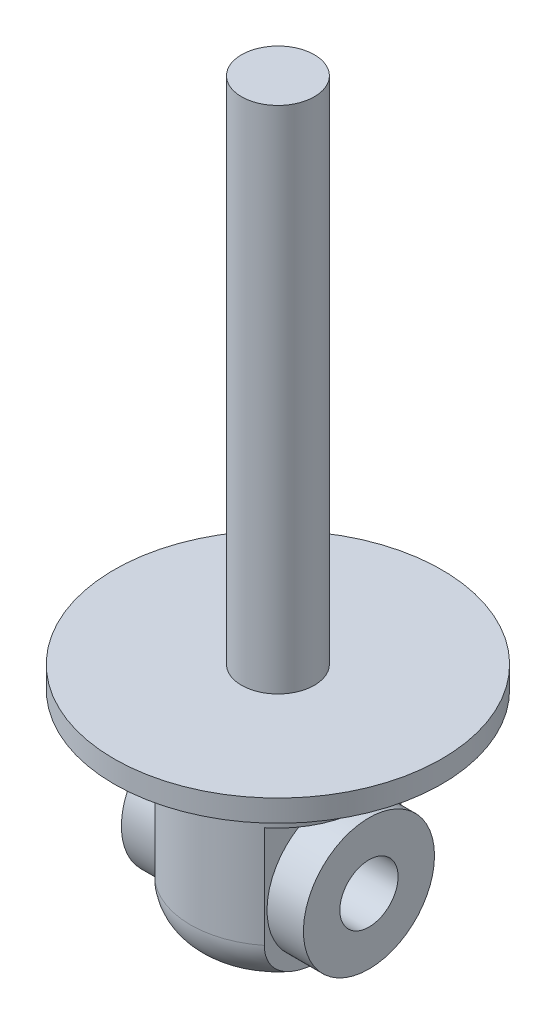
ISO-10303-21;
HEADER;
FILE_DESCRIPTION(('STEP AP214'),'2;1');
FILE_NAME('part.step','',(''),(''),'','','');
FILE_SCHEMA(('AUTOMOTIVE_DESIGN { 1 0 10303 214 1 1 1 1 }'));
ENDSEC;
DATA;
#1=APPLICATION_CONTEXT('core data for automotive mechanical design processes');
#2=APPLICATION_PROTOCOL_DEFINITION('international standard','automotive_design',2000,#1);
#3=PRODUCT_CONTEXT('',#1,'mechanical');
#4=PRODUCT('Part','Part','',(#3));
#5=PRODUCT_RELATED_PRODUCT_CATEGORY('part','',(#4));
#6=PRODUCT_DEFINITION_FORMATION('','',#4);
#7=PRODUCT_DEFINITION_CONTEXT('part definition',#1,'design');
#8=PRODUCT_DEFINITION('design','',#6,#7);
#9=PRODUCT_DEFINITION_SHAPE('','',#8);
#10=(LENGTH_UNIT() NAMED_UNIT(*) SI_UNIT(.MILLI.,.METRE.));
#11=(NAMED_UNIT(*) PLANE_ANGLE_UNIT() SI_UNIT($,.RADIAN.));
#12=(NAMED_UNIT(*) SI_UNIT($,.STERADIAN.) SOLID_ANGLE_UNIT());
#13=UNCERTAINTY_MEASURE_WITH_UNIT(LENGTH_MEASURE(1.E-05),#10,'distance_accuracy_value','');
#14=(GEOMETRIC_REPRESENTATION_CONTEXT(3) GLOBAL_UNCERTAINTY_ASSIGNED_CONTEXT((#13)) GLOBAL_UNIT_ASSIGNED_CONTEXT((#10,
#11,#12)) REPRESENTATION_CONTEXT('',''));
#15=CARTESIAN_POINT('',(0.,0.,0.));
#16=DIRECTION('',(0.,0.,1.));
#17=DIRECTION('',(1.,0.,0.));
#18=AXIS2_PLACEMENT_3D('',#15,#16,#17);
#19=CARTESIAN_POINT('',(7.5,-8.,-22.5));
#20=DIRECTION('',(-1.,0.,0.));
#21=DIRECTION('',(0.,-1.,0.));
#22=AXIS2_PLACEMENT_3D('',#19,#20,#21);
#23=PLANE('',#22);
#24=CARTESIAN_POINT('',(7.50000000000001,-27.8094750193111,0.));
#25=CARTESIAN_POINT('',(7.50000000000001,-27.8094752958151,-0.18452162824242));
#26=CARTESIAN_POINT('',(7.50000000000001,-27.8077270322999,-0.369043480287192));
#27=CARTESIAN_POINT('',(7.50000000000001,-27.8006130628877,-0.737999394292286));
#28=CARTESIAN_POINT('',(7.50000000000001,-27.7952477367066,-0.922433463434386));
#29=CARTESIAN_POINT('',(7.50000000000001,-27.780538513706,-1.29122559425462));
#30=CARTESIAN_POINT('',(7.50000000000001,-27.7711929215574,-1.47558358999919));
#31=CARTESIAN_POINT('',(7.50000000000001,-27.7479507640883,-1.84401846668315));
#32=CARTESIAN_POINT('',(7.50000000000001,-27.734054140347,-2.0280953439834));
#33=CARTESIAN_POINT('',(7.50000000000001,-27.701027325669,-2.39498843631837));
#34=CARTESIAN_POINT('',(7.50000000000001,-27.6819201299087,-2.57780665418327));
#35=CARTESIAN_POINT('',(7.50000000000001,-27.6375682217561,-2.94269408038084));
#36=CARTESIAN_POINT('',(7.50000000000001,-27.6123230495969,-3.12476323156505));
#37=CARTESIAN_POINT('',(7.50000000000001,-27.5259360262262,-3.6691632505479));
#38=CARTESIAN_POINT('',(7.50000000000001,-27.4541196223952,-4.029977395301));
#39=CARTESIAN_POINT('',(7.50000000000001,-27.315114172541,-4.57935988961709));
#40=CARTESIAN_POINT('',(7.50000000000001,-27.2608348848703,-4.7712225645297));
#41=CARTESIAN_POINT('',(7.50000000000001,-27.1402411036094,-5.15109529504943));
#42=CARTESIAN_POINT('',(7.50000000000001,-27.0739312594077,-5.3391068078654));
#43=CARTESIAN_POINT('',(7.50000000000001,-26.9281486989919,-5.70992505463464));
#44=CARTESIAN_POINT('',(7.50000000000001,-26.8486797977089,-5.89273327912081));
#45=CARTESIAN_POINT('',(7.50000000000001,-26.6756224712841,-6.25155879665884));
#46=CARTESIAN_POINT('',(7.50000000000001,-26.5820364486501,-6.4275772388346));
#47=CARTESIAN_POINT('',(7.50000000000001,-26.3958384208508,-6.74413785402998));
#48=CARTESIAN_POINT('',(7.5,-26.3053527427416,-6.8859302136676));
#49=CARTESIAN_POINT('',(7.5,-26.1136422044668,-7.16205254122039));
#50=CARTESIAN_POINT('',(7.5,-26.0124194056704,-7.29638393401337));
#51=CARTESIAN_POINT('',(7.5,-25.7991822855038,-7.55627452274062));
#52=CARTESIAN_POINT('',(7.5,-25.6871652583255,-7.6818315054992));
#53=CARTESIAN_POINT('',(7.5,-25.4525813942248,-7.92270374400352));
#54=CARTESIAN_POINT('',(7.5,-25.3300144777409,-8.03801892249803));
#55=CARTESIAN_POINT('',(7.5,-25.0736714823962,-8.25792234562975));
#56=CARTESIAN_POINT('',(7.5,-24.9398051473305,-8.36240569865935));
#57=CARTESIAN_POINT('',(7.5,-24.662616920615,-8.55796576900282));
#58=CARTESIAN_POINT('',(7.5,-24.5192963548439,-8.64904436046083));
#59=CARTESIAN_POINT('',(7.5,-24.2243409104845,-8.81636481076626));
#60=CARTESIAN_POINT('',(7.5,-24.0727112205184,-8.89261579636783));
#61=CARTESIAN_POINT('',(7.5,-23.7624095052739,-9.02909243430965));
#62=CARTESIAN_POINT('',(7.5,-23.6037388369551,-9.08932115899453));
#63=CARTESIAN_POINT('',(7.5,-23.3052245459151,-9.1849514334904));
#64=CARTESIAN_POINT('',(7.5,-23.166136129491,-9.22272405795733));
#65=CARTESIAN_POINT('',(7.5,-22.8851087613884,-9.28547940350164));
#66=CARTESIAN_POINT('',(7.5,-22.7431701638949,-9.31046370365637));
#67=CARTESIAN_POINT('',(7.5,-22.4576599589478,-9.34730641699015));
#68=CARTESIAN_POINT('',(7.5,-22.3140890586128,-9.35917031033291));
#69=CARTESIAN_POINT('',(7.5,-22.0264648581988,-9.36963164548865));
#70=CARTESIAN_POINT('',(7.5,-21.8824115750842,-9.36822954903947));
#71=CARTESIAN_POINT('',(7.5,-21.6061914815275,-9.35280339576898));
#72=CARTESIAN_POINT('',(7.5,-21.4739684759153,-9.33976569953801));
#73=CARTESIAN_POINT('',(7.5,-21.2110534946456,-9.3025636387872));
#74=CARTESIAN_POINT('',(7.5,-21.0803620180608,-9.27839574533065));
#75=CARTESIAN_POINT('',(7.5,-20.8215410609612,-9.21922065645585));
#76=CARTESIAN_POINT('',(7.5,-20.6934101253726,-9.1842198149556));
#77=CARTESIAN_POINT('',(7.5,-20.4404340442512,-9.1037455253616));
#78=CARTESIAN_POINT('',(7.5,-20.3155901493276,-9.05826815366643));
#79=CARTESIAN_POINT('',(7.5,-20.0692031015505,-8.95699564520569));
#80=CARTESIAN_POINT('',(7.5,-19.9476868658852,-8.90113499399755));
#81=CARTESIAN_POINT('',(7.5,-19.7094920695403,-8.77987692751896));
#82=CARTESIAN_POINT('',(7.5,-19.5928152563103,-8.71447610526942));
#83=CARTESIAN_POINT('',(7.5,-19.2509911073174,-8.50489875856371));
#84=CARTESIAN_POINT('',(7.5,-19.0339195251877,-8.34729299116934));
#85=CARTESIAN_POINT('',(7.5,-18.609337427954,-7.98870608163152));
#86=CARTESIAN_POINT('',(7.5,-18.4039002281567,-7.785297559506));
#87=CARTESIAN_POINT('',(7.5,-18.0246758733926,-7.35109040646742));
#88=CARTESIAN_POINT('',(7.5,-17.8508837047537,-7.12029612399673));
#89=CARTESIAN_POINT('',(7.5,-17.5744409595824,-6.69864287979114));
#90=CARTESIAN_POINT('',(7.5,-17.4648689537028,-6.51223410047272));
#91=CARTESIAN_POINT('',(7.5,-17.2626904112622,-6.13034538679085));
#92=CARTESIAN_POINT('',(7.5,-17.1700919878543,-5.93486117014358));
#93=CARTESIAN_POINT('',(7.5,-17.0006313082269,-5.53658641063457));
#94=CARTESIAN_POINT('',(7.5,-16.9238147555949,-5.33377659321379));
#95=CARTESIAN_POINT('',(7.5,-16.784875362625,-4.92331428460809));
#96=CARTESIAN_POINT('',(7.5,-16.7227484430634,-4.71566315546473));
#97=CARTESIAN_POINT('',(7.5,-16.5386673542946,-4.02250667384634));
#98=CARTESIAN_POINT('',(7.5,-16.4449803111871,-3.52942656369881));
#99=CARTESIAN_POINT('',(7.5,-16.3412352530644,-2.78498720051465));
#100=CARTESIAN_POINT('',(7.5,-16.3127705467372,-2.53568557770049));
#101=CARTESIAN_POINT('',(7.5,-16.2658269581612,-2.03612434937437));
#102=CARTESIAN_POINT('',(7.5,-16.2473468655649,-1.78586486368141));
#103=CARTESIAN_POINT('',(7.5,-16.2184283009414,-1.28363112408651));
#104=CARTESIAN_POINT('',(7.5,-16.208031590786,-1.0316546617609));
#105=CARTESIAN_POINT('',(7.5,-16.1941849220444,-0.52750119468867));
#106=CARTESIAN_POINT('',(7.5,-16.1907352988047,-0.275324180848901));
#107=CARTESIAN_POINT('',(7.5,-16.1903333462322,0.228731345602988));
#108=CARTESIAN_POINT('',(7.5,-16.193373232494,0.480609853630186));
#109=CARTESIAN_POINT('',(7.5,-16.2063332691715,0.984173581494278));
#110=CARTESIAN_POINT('',(7.5,-16.2162528039696,1.23585881660875));
#111=CARTESIAN_POINT('',(7.5,-16.2454935008677,1.76278825668934));
#112=CARTESIAN_POINT('',(7.5,-16.2656211327378,2.03798990109172));
#113=CARTESIAN_POINT('',(7.5,-16.3180418431018,2.58731345976839));
#114=CARTESIAN_POINT('',(7.5,-16.3503365349836,2.86143522597444));
#115=CARTESIAN_POINT('',(7.5,-16.4300545548583,3.40623279358437));
#116=CARTESIAN_POINT('',(7.5,-16.4774071358833,3.67691867401874));
#117=CARTESIAN_POINT('',(7.5,-16.5907053400646,4.21439476079952));
#118=CARTESIAN_POINT('',(7.5,-16.6566449229111,4.4811862031647));
#119=CARTESIAN_POINT('',(7.5,-16.7911834026755,4.94217748017443));
#120=CARTESIAN_POINT('',(7.5,-16.8549558474619,5.13778160857807));
#121=CARTESIAN_POINT('',(7.5,-16.9961265709521,5.5239942274174));
#122=CARTESIAN_POINT('',(7.5,-17.073520789267,5.71460418712137));
#123=CARTESIAN_POINT('',(7.5,-17.2430793617625,6.08921987221889));
#124=CARTESIAN_POINT('',(7.5,-17.3352463319138,6.27322442084438));
#125=CARTESIAN_POINT('',(7.5,-17.5351759469553,6.63256976145457));
#126=CARTESIAN_POINT('',(7.5,-17.6429345063483,6.80791280693598));
#127=CARTESIAN_POINT('',(7.5,-17.8487615005737,7.10989658300674));
#128=CARTESIAN_POINT('',(7.5,-17.9436617626469,7.23870103997639));
#129=CARTESIAN_POINT('',(7.5,-18.143229826346,7.48856622066219));
#130=CARTESIAN_POINT('',(7.5,-18.2478987883735,7.60962602152205));
#131=CARTESIAN_POINT('',(7.5,-18.4668045949393,7.84271387792474));
#132=CARTESIAN_POINT('',(7.5,-18.5810384459287,7.95474473789612));
#133=CARTESIAN_POINT('',(7.5,-18.8187268203134,8.16854933672494));
#134=CARTESIAN_POINT('',(7.5,-18.9421800591116,8.27032449994956));
#135=CARTESIAN_POINT('',(7.5,-19.1987356397018,8.46313596223061));
#136=CARTESIAN_POINT('',(7.5,-19.3319055781875,8.55408255407202));
#137=CARTESIAN_POINT('',(7.5,-19.6061418402457,8.72304401015933));
#138=CARTESIAN_POINT('',(7.5,-19.747204378254,8.80106500403695));
#139=CARTESIAN_POINT('',(7.5,-20.0362068877473,8.94309470867638));
#140=CARTESIAN_POINT('',(7.5,-20.1841460034049,9.00710515749597));
#141=CARTESIAN_POINT('',(7.5,-20.4856380297523,9.12014361193692));
#142=CARTESIAN_POINT('',(7.5,-20.6391901444676,9.16917373274798));
#143=CARTESIAN_POINT('',(7.5,-20.9313639562727,9.24643392787081));
#144=CARTESIAN_POINT('',(7.5,-21.0695088202567,9.27647685632879));
#145=CARTESIAN_POINT('',(7.5,-21.3479315795213,9.32406143536891));
#146=CARTESIAN_POINT('',(7.5,-21.4882092809527,9.34160421520927));
#147=CARTESIAN_POINT('',(7.5,-21.769719609589,9.36396002322678));
#148=CARTESIAN_POINT('',(7.5,-21.9109518422674,9.36877802253041));
#149=CARTESIAN_POINT('',(7.5,-22.1932734390957,9.3656361390626));
#150=CARTESIAN_POINT('',(7.5,-22.3343628067459,9.35767657732181));
#151=CARTESIAN_POINT('',(7.5,-22.6064011749062,9.32998563551062));
#152=CARTESIAN_POINT('',(7.5,-22.7374295539783,9.31102660205278));
#153=CARTESIAN_POINT('',(7.5,-22.9974780227225,9.26218788836621));
#154=CARTESIAN_POINT('',(7.5,-23.1264974548056,9.23230470755187));
#155=CARTESIAN_POINT('',(7.5,-23.3815508516768,9.16196479385525));
#156=CARTESIAN_POINT('',(7.5,-23.5075862018083,9.12151307666088));
#157=CARTESIAN_POINT('',(7.5,-23.7559772755244,9.03044888037393));
#158=CARTESIAN_POINT('',(7.5,-23.8783315975104,8.97983258590813));
#159=CARTESIAN_POINT('',(7.5,-24.1205569584555,8.86806175742509));
#160=CARTESIAN_POINT('',(7.5,-24.2403549182387,8.8067487702029));
#161=CARTESIAN_POINT('',(7.5,-24.4747211723639,8.67480187441992));
#162=CARTESIAN_POINT('',(7.5,-24.5892875713423,8.60416462323316));
#163=CARTESIAN_POINT('',(7.5,-24.9242270275788,8.37928997825773));
#164=CARTESIAN_POINT('',(7.5,-25.13600210755,8.21201407264851));
#165=CARTESIAN_POINT('',(7.5,-25.5504485361803,7.832942739178));
#166=CARTESIAN_POINT('',(7.5,-25.7507010772538,7.61853228584699));
#167=CARTESIAN_POINT('',(7.5,-26.1185076671662,7.16337882817298));
#168=CARTESIAN_POINT('',(7.50000000000001,-26.2860513710234,6.92262753032979));
#169=CARTESIAN_POINT('',(7.50000000000001,-26.5545024709803,6.47886643959529));
#170=CARTESIAN_POINT('',(7.50000000000001,-26.6619013252763,6.27970729507799));
#171=CARTESIAN_POINT('',(7.50000000000001,-26.858559219587,5.87254463104012));
#172=CARTESIAN_POINT('',(7.50000000000001,-26.9478095430477,5.664536919364));
#173=CARTESIAN_POINT('',(7.50000000000001,-27.1096214973705,5.24180758530232));
#174=CARTESIAN_POINT('',(7.50000000000001,-27.1821555960046,5.02707553901331));
#175=CARTESIAN_POINT('',(7.50000000000001,-27.3121001369762,4.59305326757355));
#176=CARTESIAN_POINT('',(7.50000000000001,-27.3695048137837,4.37376133898656));
#177=CARTESIAN_POINT('',(7.50000000000001,-27.4981886749365,3.81417726059936));
#178=CARTESIAN_POINT('',(7.50000000000001,-27.5604951716191,3.47183296905169));
#179=CARTESIAN_POINT('',(7.50000000000001,-27.6609019684328,2.78359200614869));
#180=CARTESIAN_POINT('',(7.50000000000001,-27.6989863972919,2.43769315620305));
#181=CARTESIAN_POINT('',(7.50000000000001,-27.7425563308733,1.91723181279187));
#182=CARTESIAN_POINT('',(7.50000000000001,-27.7548291128016,1.74318957751326));
#183=CARTESIAN_POINT('',(7.50000000000001,-27.7753986995787,1.39487161182967));
#184=CARTESIAN_POINT('',(7.50000000000001,-27.7836956019396,1.22059588725638));
#185=CARTESIAN_POINT('',(7.50000000000001,-27.796777523185,0.871965392986041));
#186=CARTESIAN_POINT('',(7.50000000000001,-27.8015635129394,0.697610658492173));
#187=CARTESIAN_POINT('',(7.50000000000001,-27.8079121855994,0.348837350643895));
#188=CARTESIAN_POINT('',(7.50000000000001,-27.8094747579462,0.174418775305039));
#189=CARTESIAN_POINT('',(7.50000000000001,-27.8094750193111,0.));
#190=B_SPLINE_CURVE_WITH_KNOTS('',3,(#24,#25,#26,#27,#28,#29,#30,#31,#32,#33,#34,#35,#36,#37,
#38,#39,#40,#41,#42,#43,#44,#45,#46,#47,#48,#49,#50,#51,#52,#53,#54,#55,#56,#57,#58,#59,#60,#61,
#62,#63,#64,#65,#66,#67,#68,#69,#70,#71,#72,#73,#74,#75,#76,#77,#78,#79,#80,#81,#82,#83,#84,#85,
#86,#87,#88,#89,#90,#91,#92,#93,#94,#95,#96,#97,#98,#99,#100,#101,#102,#103,#104,#105,#106,#107,
#108,#109,#110,#111,#112,#113,#114,#115,#116,#117,#118,#119,#120,#121,#122,#123,#124,#125,#126,
#127,#128,#129,#130,#131,#132,#133,#134,#135,#136,#137,#138,#139,#140,#141,#142,#143,#144,#145,
#146,#147,#148,#149,#150,#151,#152,#153,#154,#155,#156,#157,#158,#159,#160,#161,#162,#163,#164,
#165,#166,#167,#168,#169,#170,#171,#172,#173,#174,#175,#176,#177,#178,#179,#180,#181,#182,#183,
#184,#185,#186,#187,#188,#189),.UNSPECIFIED.,.T.,.F.,(4,2,2,2,2,2,2,2,2,2,2,2,2,2,2,2,2,2,2,2,2,
2,2,2,2,2,2,2,2,2,2,2,2,2,2,2,2,2,2,2,2,2,2,2,2,2,2,2,2,2,2,2,2,2,2,2,2,2,2,2,2,2,2,2,2,2,2,2,2,
2,2,2,2,2,2,2,2,2,2,2,2,2,4),(0.,0.553556541747909,1.10705498067111,1.66078940935171,
2.21453094651203,2.7658672034967,3.31724477121586,4.41912680182767,5.01698525599298,
5.61461314908643,6.21206808675635,6.80942146164093,7.31357153503218,7.81762499361293,
8.32180513447663,8.82598907791494,9.33467160980089,9.84328295415676,10.3515802378956,
10.8597799828438,11.291588037567,11.7233427606026,12.1549170790764,12.5864763761707,
12.9845986570771,13.3828472534997,13.7808627038906,14.1790274594522,14.579795450788,
14.9807069160888,15.7821103743006,16.6461503316802,17.5100532757815,18.1578732554314,
18.8060020817716,19.4559821948789,20.1057815998326,21.6069748462106,22.3596793389022,
23.1122925673176,23.8687687149109,24.6252813779039,25.3808870860739,26.1364251884592,
26.9640249034878,27.7917343993232,28.6156111127982,29.4392203950451,30.0559954213972,
30.6725869093733,31.2892877047367,31.9058271963483,32.3853559200308,32.8649416785199,
33.3443778968313,33.823747436381,34.3068464150843,34.7897156366603,35.2725249226045,
35.7552660053908,36.1788379642465,36.6023716529343,37.0257398573389,37.4490974249689,
37.8458122806135,38.2426543730445,38.6393084704929,39.0361117351622,39.4393886143668,
39.8428104576491,40.6491243408277,41.5260051520067,42.4031628508039,43.0810551134699,
43.7592721958252,44.4385984678267,45.1181832448308,46.1608437011148,47.2041866484774,
47.7275747628343,48.2509500399341,48.7741805338585,49.2974289735857),.UNSPECIFIED.);
#191=CARTESIAN_POINT('',(7.5,-22.,9.3674969975976));
#192=VERTEX_POINT('',#191);
#193=CARTESIAN_POINT('',(7.5,-21.9999999999999,-9.36749699759765));
#194=VERTEX_POINT('',#193);
#195=EDGE_CURVE('E125',#192,#194,#190,.T.);
#196=ORIENTED_EDGE('',*,*,#195,.T.);
#197=DIRECTION('',(0.,1.,0.));
#198=VECTOR('',#197,1.);
#199=CARTESIAN_POINT('',(7.5,-28.,-9.3674969975976));
#200=LINE('',#199,#198);
#201=CARTESIAN_POINT('',(7.5,-8.,-9.3674969975976));
#202=VERTEX_POINT('',#201);
#203=EDGE_CURVE('E99',#202,#194,#200,.F.);
#204=ORIENTED_EDGE('',*,*,#203,.F.);
#205=DIRECTION('',(0.,0.,1.));
#206=VECTOR('',#205,1.);
#207=CARTESIAN_POINT('',(7.5,-8.,-22.5));
#208=LINE('',#207,#206);
#209=CARTESIAN_POINT('',(7.5,-8.,9.3674969975976));
#210=VERTEX_POINT('',#209);
#211=EDGE_CURVE('E96',#202,#210,#208,.T.);
#212=ORIENTED_EDGE('',*,*,#211,.T.);
#213=DIRECTION('',(0.,1.,0.));
#214=VECTOR('',#213,1.);
#215=CARTESIAN_POINT('',(7.5,-28.,9.3674969975976));
#216=LINE('',#215,#214);
#217=EDGE_CURVE('E104',#192,#210,#216,.T.);
#218=ORIENTED_EDGE('',*,*,#217,.F.);
#219=EDGE_LOOP('',(#196,#204,#212,#218));
#220=FACE_BOUND('',#219,.T.);
#221=CARTESIAN_POINT('',(7.5,-18.,0.));
#222=DIRECTION('',(-1.,0.,0.));
#223=DIRECTION('',(0.,-1.,0.));
#224=AXIS2_PLACEMENT_3D('',#221,#222,#223);
#225=CIRCLE('',#224,9.);
#226=CARTESIAN_POINT('',(7.50000000000001,-27.,0.));
#227=VERTEX_POINT('',#226);
#228=EDGE_CURVE('E11',#227,#227,#225,.F.);
#229=ORIENTED_EDGE('',*,*,#228,.F.);
#230=EDGE_LOOP('',(#229));
#231=FACE_BOUND('',#230,.T.);
#232=ADVANCED_FACE('F35',(#220,#231),#23,.F.);
#233=CARTESIAN_POINT('',(-7.5,-8.,-22.5));
#234=DIRECTION('',(1.,0.,0.));
#235=DIRECTION('',(0.,0.,-1.));
#236=AXIS2_PLACEMENT_3D('',#233,#234,#235);
#237=PLANE('',#236);
#238=CARTESIAN_POINT('',(-7.5,-27.8094750193111,0.));
#239=CARTESIAN_POINT('',(-7.5,-27.8094752958151,0.18452162824242));
#240=CARTESIAN_POINT('',(-7.5,-27.8077270322999,0.369043480287192));
#241=CARTESIAN_POINT('',(-7.5,-27.8006130628877,0.737999394292284));
#242=CARTESIAN_POINT('',(-7.5,-27.7952477367066,0.922433463434384));
#243=CARTESIAN_POINT('',(-7.5,-27.780538513706,1.29122559425462));
#244=CARTESIAN_POINT('',(-7.5,-27.7711929215574,1.47558358999919));
#245=CARTESIAN_POINT('',(-7.5,-27.7479507640883,1.84401846668315));
#246=CARTESIAN_POINT('',(-7.5,-27.734054140347,2.02809534398339));
#247=CARTESIAN_POINT('',(-7.5,-27.701027325669,2.39498843631837));
#248=CARTESIAN_POINT('',(-7.5,-27.6819201299087,2.57780665418326));
#249=CARTESIAN_POINT('',(-7.5,-27.6375682217561,2.94269408038083));
#250=CARTESIAN_POINT('',(-7.5,-27.6123230495969,3.12476323156505));
#251=CARTESIAN_POINT('',(-7.5,-27.5259360262262,3.6691632505479));
#252=CARTESIAN_POINT('',(-7.5,-27.4541196223952,4.02997739530099));
#253=CARTESIAN_POINT('',(-7.5,-27.315114172541,4.57935988961709));
#254=CARTESIAN_POINT('',(-7.5,-27.2608348848703,4.77122256452969));
#255=CARTESIAN_POINT('',(-7.5,-27.1402411036094,5.15109529504943));
#256=CARTESIAN_POINT('',(-7.5,-27.0739312594077,5.33910680786539));
#257=CARTESIAN_POINT('',(-7.5,-26.9281486989919,5.70992505463463));
#258=CARTESIAN_POINT('',(-7.5,-26.8486797977089,5.8927332791208));
#259=CARTESIAN_POINT('',(-7.5,-26.6756224712841,6.25155879665883));
#260=CARTESIAN_POINT('',(-7.5,-26.5820364486501,6.4275772388346));
#261=CARTESIAN_POINT('',(-7.5,-26.3958384208508,6.74413785402998));
#262=CARTESIAN_POINT('',(-7.5,-26.3053527427416,6.8859302136676));
#263=CARTESIAN_POINT('',(-7.5,-26.1136422044668,7.16205254122039));
#264=CARTESIAN_POINT('',(-7.5,-26.0124194056704,7.29638393401336));
#265=CARTESIAN_POINT('',(-7.5,-25.7991822855038,7.55627452274062));
#266=CARTESIAN_POINT('',(-7.5,-25.6871652583255,7.6818315054992));
#267=CARTESIAN_POINT('',(-7.5,-25.4525813942248,7.92270374400352));
#268=CARTESIAN_POINT('',(-7.5,-25.3300144777409,8.03801892249803));
#269=CARTESIAN_POINT('',(-7.5,-25.0736714823962,8.25792234562975));
#270=CARTESIAN_POINT('',(-7.5,-24.9398051473305,8.36240569865935));
#271=CARTESIAN_POINT('',(-7.5,-24.662616920615,8.55796576900282));
#272=CARTESIAN_POINT('',(-7.5,-24.5192963548439,8.64904436046083));
#273=CARTESIAN_POINT('',(-7.5,-24.2243409104845,8.81636481076627));
#274=CARTESIAN_POINT('',(-7.5,-24.0727112205184,8.89261579636784));
#275=CARTESIAN_POINT('',(-7.5,-23.7624095052739,9.02909243430965));
#276=CARTESIAN_POINT('',(-7.5,-23.6037388369551,9.08932115899453));
#277=CARTESIAN_POINT('',(-7.5,-23.3052245459151,9.1849514334904));
#278=CARTESIAN_POINT('',(-7.5,-23.1661361294911,9.22272405795734));
#279=CARTESIAN_POINT('',(-7.5,-22.8851087613884,9.28547940350164));
#280=CARTESIAN_POINT('',(-7.5,-22.7431701638949,9.31046370365637));
#281=CARTESIAN_POINT('',(-7.5,-22.4576599589478,9.34730641699016));
#282=CARTESIAN_POINT('',(-7.5,-22.3140890586128,9.35917031033292));
#283=CARTESIAN_POINT('',(-7.5,-22.0264648581988,9.36963164548865));
#284=CARTESIAN_POINT('',(-7.5,-21.8824115750842,9.36822954903947));
#285=CARTESIAN_POINT('',(-7.5,-21.6061914815275,9.35280339576898));
#286=CARTESIAN_POINT('',(-7.5,-21.4739684759153,9.33976569953801));
#287=CARTESIAN_POINT('',(-7.5,-21.2110534946456,9.30256363878721));
#288=CARTESIAN_POINT('',(-7.5,-21.0803620180608,9.27839574533066));
#289=CARTESIAN_POINT('',(-7.5,-20.8215410609612,9.21922065645586));
#290=CARTESIAN_POINT('',(-7.5,-20.6934101253726,9.1842198149556));
#291=CARTESIAN_POINT('',(-7.5,-20.4404340442512,9.1037455253616));
#292=CARTESIAN_POINT('',(-7.5,-20.3155901493276,9.05826815366643));
#293=CARTESIAN_POINT('',(-7.5,-20.0692031015505,8.95699564520569));
#294=CARTESIAN_POINT('',(-7.5,-19.9476868658852,8.90113499399755));
#295=CARTESIAN_POINT('',(-7.5,-19.7094920695403,8.77987692751896));
#296=CARTESIAN_POINT('',(-7.5,-19.5928152563103,8.71447610526943));
#297=CARTESIAN_POINT('',(-7.5,-19.2509911073174,8.50489875856371));
#298=CARTESIAN_POINT('',(-7.5,-19.0339195251877,8.34729299116934));
#299=CARTESIAN_POINT('',(-7.5,-18.609337427954,7.98870608163153));
#300=CARTESIAN_POINT('',(-7.5,-18.4039002281567,7.78529755950601));
#301=CARTESIAN_POINT('',(-7.5,-18.0246758733926,7.35109040646743));
#302=CARTESIAN_POINT('',(-7.5,-17.8508837047537,7.12029612399674));
#303=CARTESIAN_POINT('',(-7.5,-17.5744409595824,6.69864287979115));
#304=CARTESIAN_POINT('',(-7.5,-17.4648689537028,6.51223410047273));
#305=CARTESIAN_POINT('',(-7.5,-17.2626904112622,6.13034538679086));
#306=CARTESIAN_POINT('',(-7.5,-17.1700919878543,5.93486117014358));
#307=CARTESIAN_POINT('',(-7.5,-17.0006313082269,5.53658641063457));
#308=CARTESIAN_POINT('',(-7.5,-16.9238147555949,5.3337765932138));
#309=CARTESIAN_POINT('',(-7.5,-16.784875362625,4.9233142846081));
#310=CARTESIAN_POINT('',(-7.5,-16.7227484430634,4.71566315546474));
#311=CARTESIAN_POINT('',(-7.5,-16.5386673542946,4.02250667384635));
#312=CARTESIAN_POINT('',(-7.5,-16.4449803111871,3.52942656369881));
#313=CARTESIAN_POINT('',(-7.5,-16.3412352530644,2.78498720051466));
#314=CARTESIAN_POINT('',(-7.5,-16.3127705467372,2.53568557770049));
#315=CARTESIAN_POINT('',(-7.5,-16.2658269581612,2.03612434937438));
#316=CARTESIAN_POINT('',(-7.5,-16.2473468655649,1.78586486368141));
#317=CARTESIAN_POINT('',(-7.5,-16.2184283009414,1.28363112408652));
#318=CARTESIAN_POINT('',(-7.5,-16.208031590786,1.03165466176091));
#319=CARTESIAN_POINT('',(-7.5,-16.1941849220444,0.527501194688673));
#320=CARTESIAN_POINT('',(-7.5,-16.1907352988047,0.275324180848904));
#321=CARTESIAN_POINT('',(-7.5,-16.1903333462322,-0.228731345602983));
#322=CARTESIAN_POINT('',(-7.5,-16.193373232494,-0.480609853630182));
#323=CARTESIAN_POINT('',(-7.5,-16.2063332691715,-0.984173581494274));
#324=CARTESIAN_POINT('',(-7.5,-16.2162528039696,-1.23585881660875));
#325=CARTESIAN_POINT('',(-7.5,-16.2454935008677,-1.76278825668934));
#326=CARTESIAN_POINT('',(-7.5,-16.2656211327378,-2.03798990109172));
#327=CARTESIAN_POINT('',(-7.5,-16.3180418431018,-2.58731345976839));
#328=CARTESIAN_POINT('',(-7.5,-16.3503365349836,-2.86143522597444));
#329=CARTESIAN_POINT('',(-7.5,-16.4300545548583,-3.40623279358437));
#330=CARTESIAN_POINT('',(-7.5,-16.4774071358833,-3.67691867401873));
#331=CARTESIAN_POINT('',(-7.5,-16.5907053400646,-4.21439476079952));
#332=CARTESIAN_POINT('',(-7.5,-16.6566449229111,-4.4811862031647));
#333=CARTESIAN_POINT('',(-7.5,-16.7911834026755,-4.94217748017443));
#334=CARTESIAN_POINT('',(-7.5,-16.8549558474619,-5.13778160857807));
#335=CARTESIAN_POINT('',(-7.5,-16.9961265709521,-5.52399422741739));
#336=CARTESIAN_POINT('',(-7.5,-17.0735207892669,-5.71460418712136));
#337=CARTESIAN_POINT('',(-7.5,-17.2430793617625,-6.08921987221889));
#338=CARTESIAN_POINT('',(-7.5,-17.3352463319138,-6.27322442084438));
#339=CARTESIAN_POINT('',(-7.5,-17.5351759469553,-6.63256976145457));
#340=CARTESIAN_POINT('',(-7.5,-17.6429345063483,-6.80791280693598));
#341=CARTESIAN_POINT('',(-7.5,-17.8487615005736,-7.10989658300674));
#342=CARTESIAN_POINT('',(-7.5,-17.9436617626469,-7.23870103997639));
#343=CARTESIAN_POINT('',(-7.5,-18.143229826346,-7.48856622066219));
#344=CARTESIAN_POINT('',(-7.5,-18.2478987883735,-7.60962602152205));
#345=CARTESIAN_POINT('',(-7.5,-18.4668045949393,-7.84271387792474));
#346=CARTESIAN_POINT('',(-7.5,-18.5810384459287,-7.95474473789612));
#347=CARTESIAN_POINT('',(-7.5,-18.8187268203134,-8.16854933672494));
#348=CARTESIAN_POINT('',(-7.5,-18.9421800591116,-8.27032449994957));
#349=CARTESIAN_POINT('',(-7.5,-19.1987356397018,-8.46313596223061));
#350=CARTESIAN_POINT('',(-7.5,-19.3319055781875,-8.55408255407203));
#351=CARTESIAN_POINT('',(-7.5,-19.6061418402457,-8.72304401015934));
#352=CARTESIAN_POINT('',(-7.5,-19.747204378254,-8.80106500403696));
#353=CARTESIAN_POINT('',(-7.5,-20.0362068877473,-8.94309470867639));
#354=CARTESIAN_POINT('',(-7.5,-20.1841460034049,-9.00710515749598));
#355=CARTESIAN_POINT('',(-7.5,-20.4856380297523,-9.12014361193693));
#356=CARTESIAN_POINT('',(-7.5,-20.6391901444676,-9.16917373274798));
#357=CARTESIAN_POINT('',(-7.5,-20.9313639562727,-9.24643392787081));
#358=CARTESIAN_POINT('',(-7.5,-21.0695088202567,-9.27647685632879));
#359=CARTESIAN_POINT('',(-7.5,-21.3479315795213,-9.32406143536891));
#360=CARTESIAN_POINT('',(-7.5,-21.4882092809526,-9.34160421520928));
#361=CARTESIAN_POINT('',(-7.5,-21.769719609589,-9.36396002322679));
#362=CARTESIAN_POINT('',(-7.5,-21.9109518422674,-9.36877802253041));
#363=CARTESIAN_POINT('',(-7.5,-22.1932734390957,-9.3656361390626));
#364=CARTESIAN_POINT('',(-7.5,-22.3343628067459,-9.35767657732182));
#365=CARTESIAN_POINT('',(-7.5,-22.6064011749062,-9.32998563551062));
#366=CARTESIAN_POINT('',(-7.5,-22.7374295539783,-9.31102660205279));
#367=CARTESIAN_POINT('',(-7.5,-22.9974780227225,-9.26218788836622));
#368=CARTESIAN_POINT('',(-7.5,-23.1264974548056,-9.23230470755187));
#369=CARTESIAN_POINT('',(-7.5,-23.3815508516768,-9.16196479385525));
#370=CARTESIAN_POINT('',(-7.5,-23.5075862018083,-9.12151307666088));
#371=CARTESIAN_POINT('',(-7.5,-23.7559772755244,-9.03044888037393));
#372=CARTESIAN_POINT('',(-7.5,-23.8783315975104,-8.97983258590814));
#373=CARTESIAN_POINT('',(-7.5,-24.1205569584555,-8.8680617574251));
#374=CARTESIAN_POINT('',(-7.5,-24.2403549182387,-8.80674877020291));
#375=CARTESIAN_POINT('',(-7.5,-24.4747211723639,-8.67480187441993));
#376=CARTESIAN_POINT('',(-7.5,-24.5892875713423,-8.60416462323317));
#377=CARTESIAN_POINT('',(-7.5,-24.9242270275788,-8.37928997825773));
#378=CARTESIAN_POINT('',(-7.5,-25.13600210755,-8.21201407264852));
#379=CARTESIAN_POINT('',(-7.5,-25.5504485361803,-7.832942739178));
#380=CARTESIAN_POINT('',(-7.5,-25.7507010772538,-7.618532285847));
#381=CARTESIAN_POINT('',(-7.5,-26.1185076671662,-7.16337882817298));
#382=CARTESIAN_POINT('',(-7.5,-26.2860513710234,-6.9226275303298));
#383=CARTESIAN_POINT('',(-7.5,-26.5545024709803,-6.4788664395953));
#384=CARTESIAN_POINT('',(-7.5,-26.6619013252763,-6.279707295078));
#385=CARTESIAN_POINT('',(-7.5,-26.858559219587,-5.87254463104013));
#386=CARTESIAN_POINT('',(-7.5,-26.9478095430477,-5.66453691936401));
#387=CARTESIAN_POINT('',(-7.5,-27.1096214973705,-5.24180758530233));
#388=CARTESIAN_POINT('',(-7.5,-27.1821555960046,-5.02707553901332));
#389=CARTESIAN_POINT('',(-7.5,-27.3121001369762,-4.59305326757356));
#390=CARTESIAN_POINT('',(-7.5,-27.3695048137837,-4.37376133898657));
#391=CARTESIAN_POINT('',(-7.5,-27.4981886749365,-3.81417726059937));
#392=CARTESIAN_POINT('',(-7.5,-27.5604951716191,-3.47183296905169));
#393=CARTESIAN_POINT('',(-7.5,-27.6609019684328,-2.78359200614869));
#394=CARTESIAN_POINT('',(-7.5,-27.6989863972919,-2.43769315620305));
#395=CARTESIAN_POINT('',(-7.5,-27.7425563308733,-1.91723181279188));
#396=CARTESIAN_POINT('',(-7.5,-27.7548291128016,-1.74318957751326));
#397=CARTESIAN_POINT('',(-7.5,-27.7753986995787,-1.39487161182967));
#398=CARTESIAN_POINT('',(-7.5,-27.7836956019396,-1.22059588725638));
#399=CARTESIAN_POINT('',(-7.5,-27.796777523185,-0.871965392986039));
#400=CARTESIAN_POINT('',(-7.5,-27.8015635129394,-0.69761065849217));
#401=CARTESIAN_POINT('',(-7.5,-27.8079121855994,-0.348837350643893));
#402=CARTESIAN_POINT('',(-7.5,-27.8094747579462,-0.174418775305038));
#403=CARTESIAN_POINT('',(-7.5,-27.8094750193111,0.));
#404=B_SPLINE_CURVE_WITH_KNOTS('',3,(#238,#239,#240,#241,#242,#243,#244,#245,#246,#247,#248,
#249,#250,#251,#252,#253,#254,#255,#256,#257,#258,#259,#260,#261,#262,#263,#264,#265,#266,#267,
#268,#269,#270,#271,#272,#273,#274,#275,#276,#277,#278,#279,#280,#281,#282,#283,#284,#285,#286,
#287,#288,#289,#290,#291,#292,#293,#294,#295,#296,#297,#298,#299,#300,#301,#302,#303,#304,#305,
#306,#307,#308,#309,#310,#311,#312,#313,#314,#315,#316,#317,#318,#319,#320,#321,#322,#323,#324,
#325,#326,#327,#328,#329,#330,#331,#332,#333,#334,#335,#336,#337,#338,#339,#340,#341,#342,#343,
#344,#345,#346,#347,#348,#349,#350,#351,#352,#353,#354,#355,#356,#357,#358,#359,#360,#361,#362,
#363,#364,#365,#366,#367,#368,#369,#370,#371,#372,#373,#374,#375,#376,#377,#378,#379,#380,#381,
#382,#383,#384,#385,#386,#387,#388,#389,#390,#391,#392,#393,#394,#395,#396,#397,#398,#399,#400,
#401,#402,#403),.UNSPECIFIED.,.T.,.F.,(4,2,2,2,2,2,2,2,2,2,2,2,2,2,2,2,2,2,2,2,2,2,2,2,2,2,2,2,
2,2,2,2,2,2,2,2,2,2,2,2,2,2,2,2,2,2,2,2,2,2,2,2,2,2,2,2,2,2,2,2,2,2,2,2,2,2,2,2,2,2,2,2,2,2,2,2,
2,2,2,2,2,2,4),(0.,0.553556541747908,1.10705498067111,1.66078940935171,2.21453094651203,
2.7658672034967,3.31724477121585,4.41912680182767,5.01698525599297,5.61461314908642,
6.21206808675635,6.80942146164093,7.31357153503217,7.81762499361292,8.32180513447662,
8.82598907791494,9.33467160980088,9.84328295415676,10.3515802378956,10.8597799828438,
11.291588037567,11.7233427606026,12.1549170790764,12.5864763761707,12.9845986570771,
13.3828472534997,13.7808627038906,14.1790274594522,14.579795450788,14.9807069160888,
15.7821103743006,16.6461503316802,17.5100532757815,18.1578732554314,18.8060020817717,
19.4559821948789,20.1057815998326,21.6069748462106,22.3596793389022,23.1122925673176,
23.8687687149109,24.625281377904,25.3808870860739,26.1364251884592,26.9640249034878,
27.7917343993232,28.6156111127982,29.4392203950451,30.0559954213972,30.6725869093733,
31.2892877047367,31.9058271963483,32.3853559200308,32.86494167852,33.3443778968313,
33.823747436381,34.3068464150843,34.7897156366604,35.2725249226045,35.7552660053908,
36.1788379642465,36.6023716529343,37.0257398573389,37.4490974249689,37.8458122806135,
38.2426543730445,38.639308470493,39.0361117351622,39.4393886143668,39.8428104576492,
40.6491243408277,41.5260051520067,42.4031628508039,43.0810551134699,43.7592721958252,
44.4385984678267,45.1181832448308,46.1608437011148,47.2041866484774,47.7275747628343,
48.2509500399341,48.7741805338585,49.2974289735857),.UNSPECIFIED.);
#405=CARTESIAN_POINT('',(-7.5,-22.,-9.3674969975976));
#406=VERTEX_POINT('',#405);
#407=CARTESIAN_POINT('',(-7.5,-21.9999999999999,9.36749699759766));
#408=VERTEX_POINT('',#407);
#409=EDGE_CURVE('E84',#406,#408,#404,.T.);
#410=ORIENTED_EDGE('',*,*,#409,.T.);
#411=DIRECTION('',(0.,1.,0.));
#412=VECTOR('',#411,1.);
#413=CARTESIAN_POINT('',(-7.5,-28.,9.3674969975976));
#414=LINE('',#413,#412);
#415=CARTESIAN_POINT('',(-7.5,-8.,9.36749699759759));
#416=VERTEX_POINT('',#415);
#417=EDGE_CURVE('E87',#416,#408,#414,.F.);
#418=ORIENTED_EDGE('',*,*,#417,.F.);
#419=DIRECTION('',(0.,0.,1.));
#420=VECTOR('',#419,1.);
#421=CARTESIAN_POINT('',(-7.5,-8.,-22.5));
#422=LINE('',#421,#420);
#423=CARTESIAN_POINT('',(-7.5,-8.,-9.36749699759761));
#424=VERTEX_POINT('',#423);
#425=EDGE_CURVE('E83',#424,#416,#422,.T.);
#426=ORIENTED_EDGE('',*,*,#425,.F.);
#427=DIRECTION('',(0.,1.,0.));
#428=VECTOR('',#427,1.);
#429=CARTESIAN_POINT('',(-7.5,-28.,-9.3674969975976));
#430=LINE('',#429,#428);
#431=EDGE_CURVE('E52',#406,#424,#430,.T.);
#432=ORIENTED_EDGE('',*,*,#431,.F.);
#433=EDGE_LOOP('',(#410,#418,#426,#432));
#434=FACE_BOUND('',#433,.T.);
#435=CARTESIAN_POINT('',(-7.5,-18.,0.));
#436=DIRECTION('',(1.,0.,0.));
#437=DIRECTION('',(0.,0.,-1.));
#438=AXIS2_PLACEMENT_3D('',#435,#436,#437);
#439=CIRCLE('',#438,9.);
#440=CARTESIAN_POINT('',(-7.5,-18.,-9.));
#441=VERTEX_POINT('',#440);
#442=EDGE_CURVE('E40',#441,#441,#439,.F.);
#443=ORIENTED_EDGE('',*,*,#442,.F.);
#444=EDGE_LOOP('',(#443));
#445=FACE_BOUND('',#444,.T.);
#446=ADVANCED_FACE('F85',(#434,#445),#237,.F.);
#447=CARTESIAN_POINT('',(0.,3.,0.));
#448=DIRECTION('',(0.,-1.,0.));
#449=DIRECTION('',(0.,0.,-1.));
#450=AXIS2_PLACEMENT_3D('',#447,#448,#449);
#451=CYLINDRICAL_SURFACE('',#450,22.5);
#452=CARTESIAN_POINT('',(0.,3.,0.));
#453=DIRECTION('',(0.,1.,0.));
#454=DIRECTION('',(0.,0.,1.));
#455=AXIS2_PLACEMENT_3D('',#452,#453,#454);
#456=CIRCLE('',#455,22.5);
#457=CARTESIAN_POINT('',(0.,3.,22.5));
#458=VERTEX_POINT('',#457);
#459=EDGE_CURVE('E113',#458,#458,#456,.T.);
#460=ORIENTED_EDGE('',*,*,#459,.F.);
#461=EDGE_LOOP('',(#460));
#462=FACE_BOUND('',#461,.T.);
#463=CARTESIAN_POINT('',(0.,0.,0.));
#464=DIRECTION('',(0.,1.,0.));
#465=DIRECTION('',(0.,0.,1.));
#466=AXIS2_PLACEMENT_3D('',#463,#464,#465);
#467=CIRCLE('',#466,22.5);
#468=CARTESIAN_POINT('',(0.,0.,22.5));
#469=VERTEX_POINT('',#468);
#470=EDGE_CURVE('E110',#469,#469,#467,.T.);
#471=ORIENTED_EDGE('',*,*,#470,.T.);
#472=EDGE_LOOP('',(#471));
#473=FACE_BOUND('',#472,.T.);
#474=ADVANCED_FACE('F157',(#462,#473),#451,.T.);
#475=CARTESIAN_POINT('',(0.,3.,0.));
#476=DIRECTION('',(0.,1.,0.));
#477=DIRECTION('',(0.,0.,1.));
#478=AXIS2_PLACEMENT_3D('',#475,#476,#477);
#479=PLANE('',#478);
#480=CARTESIAN_POINT('',(0.,3.,0.));
#481=DIRECTION('',(0.,1.,0.));
#482=DIRECTION('',(0.,0.,1.));
#483=AXIS2_PLACEMENT_3D('',#480,#481,#482);
#484=CIRCLE('',#483,5.);
#485=CARTESIAN_POINT('',(0.,3.,5.));
#486=VERTEX_POINT('',#485);
#487=EDGE_CURVE('E106',#486,#486,#484,.T.);
#488=ORIENTED_EDGE('',*,*,#487,.F.);
#489=EDGE_LOOP('',(#488));
#490=FACE_BOUND('',#489,.T.);
#491=ORIENTED_EDGE('',*,*,#459,.T.);
#492=EDGE_LOOP('',(#491));
#493=FACE_BOUND('',#492,.T.);
#494=ADVANCED_FACE('F154',(#490,#493),#479,.T.);
#495=CARTESIAN_POINT('',(0.,0.,0.));
#496=DIRECTION('',(0.,1.,0.));
#497=DIRECTION('',(0.,0.,1.));
#498=AXIS2_PLACEMENT_3D('',#495,#496,#497);
#499=PLANE('',#498);
#500=CARTESIAN_POINT('',(0.,0.,0.));
#501=DIRECTION('',(0.,1.,0.));
#502=DIRECTION('',(0.,0.,1.));
#503=AXIS2_PLACEMENT_3D('',#500,#501,#502);
#504=CIRCLE('',#503,12.);
#505=CARTESIAN_POINT('',(0.,0.,12.));
#506=VERTEX_POINT('',#505);
#507=EDGE_CURVE('E116',#506,#506,#504,.F.);
#508=ORIENTED_EDGE('',*,*,#507,.F.);
#509=EDGE_LOOP('',(#508));
#510=FACE_BOUND('',#509,.T.);
#511=ORIENTED_EDGE('',*,*,#470,.F.);
#512=EDGE_LOOP('',(#511));
#513=FACE_BOUND('',#512,.T.);
#514=ADVANCED_FACE('F152',(#510,#513),#499,.F.);
#515=CARTESIAN_POINT('',(0.,73.,0.));
#516=DIRECTION('',(0.,-1.,0.));
#517=DIRECTION('',(0.,0.,-1.));
#518=AXIS2_PLACEMENT_3D('',#515,#516,#517);
#519=CYLINDRICAL_SURFACE('',#518,5.);
#520=CARTESIAN_POINT('',(0.,73.,0.));
#521=DIRECTION('',(0.,1.,0.));
#522=DIRECTION('',(0.,0.,1.));
#523=AXIS2_PLACEMENT_3D('',#520,#521,#522);
#524=CIRCLE('',#523,5.);
#525=CARTESIAN_POINT('',(0.,73.,5.));
#526=VERTEX_POINT('',#525);
#527=EDGE_CURVE('E107',#526,#526,#524,.T.);
#528=ORIENTED_EDGE('',*,*,#527,.F.);
#529=EDGE_LOOP('',(#528));
#530=FACE_BOUND('',#529,.T.);
#531=ORIENTED_EDGE('',*,*,#487,.T.);
#532=EDGE_LOOP('',(#531));
#533=FACE_BOUND('',#532,.T.);
#534=ADVANCED_FACE('F148',(#530,#533),#519,.T.);
#535=CARTESIAN_POINT('',(0.,73.,0.));
#536=DIRECTION('',(0.,1.,0.));
#537=DIRECTION('',(0.,0.,1.));
#538=AXIS2_PLACEMENT_3D('',#535,#536,#537);
#539=PLANE('',#538);
#540=ORIENTED_EDGE('',*,*,#527,.T.);
#541=EDGE_LOOP('',(#540));
#542=FACE_BOUND('',#541,.T.);
#543=ADVANCED_FACE('F145',(#542),#539,.T.);
#544=CARTESIAN_POINT('',(0.,-28.,0.));
#545=DIRECTION('',(0.,1.,0.));
#546=DIRECTION('',(0.,0.,1.));
#547=AXIS2_PLACEMENT_3D('',#544,#545,#546);
#548=CYLINDRICAL_SURFACE('',#547,12.);
#549=CARTESIAN_POINT('',(0.,-22.,0.));
#550=DIRECTION('',(0.,-1.,0.));
#551=DIRECTION('',(0.,0.,-1.));
#552=AXIS2_PLACEMENT_3D('',#549,#550,#551);
#553=CIRCLE('',#552,12.);
#554=EDGE_CURVE('E95',#194,#406,#553,.F.);
#555=ORIENTED_EDGE('',*,*,#554,.T.);
#556=ORIENTED_EDGE('',*,*,#431,.T.);
#557=CARTESIAN_POINT('',(0.,-8.,0.));
#558=DIRECTION('',(0.,1.,0.));
#559=DIRECTION('',(-1.,0.,0.));
#560=AXIS2_PLACEMENT_3D('',#557,#558,#559);
#561=CIRCLE('',#560,12.);
#562=EDGE_CURVE('E81',#424,#416,#561,.T.);
#563=ORIENTED_EDGE('',*,*,#562,.T.);
#564=ORIENTED_EDGE('',*,*,#417,.T.);
#565=EDGE_CURVE('E60',#408,#192,#553,.F.);
#566=ORIENTED_EDGE('',*,*,#565,.T.);
#567=ORIENTED_EDGE('',*,*,#217,.T.);
#568=CARTESIAN_POINT('',(0.,-8.,0.));
#569=DIRECTION('',(0.,1.,0.));
#570=DIRECTION('',(-1.,0.,0.));
#571=AXIS2_PLACEMENT_3D('',#568,#569,#570);
#572=CIRCLE('',#571,12.);
#573=EDGE_CURVE('E130',#210,#202,#572,.T.);
#574=ORIENTED_EDGE('',*,*,#573,.T.);
#575=ORIENTED_EDGE('',*,*,#203,.T.);
#576=EDGE_LOOP('',(#555,#556,#563,#564,#566,#567,#574,#575));
#577=FACE_BOUND('',#576,.T.);
#578=ORIENTED_EDGE('',*,*,#507,.T.);
#579=EDGE_LOOP('',(#578));
#580=FACE_BOUND('',#579,.T.);
#581=ADVANCED_FACE('F91',(#577,#580),#548,.T.);
#582=CARTESIAN_POINT('',(0.,-28.,0.));
#583=DIRECTION('',(0.,-1.,0.));
#584=DIRECTION('',(0.,0.,-1.));
#585=AXIS2_PLACEMENT_3D('',#582,#583,#584);
#586=PLANE('',#585);
#587=CARTESIAN_POINT('',(0.,-28.,0.));
#588=DIRECTION('',(0.,-1.,0.));
#589=DIRECTION('',(0.,0.,-1.));
#590=AXIS2_PLACEMENT_3D('',#587,#588,#589);
#591=CIRCLE('',#590,6.);
#592=CARTESIAN_POINT('',(0.,-28.,-6.));
#593=VERTEX_POINT('',#592);
#594=EDGE_CURVE('E121',#593,#593,#591,.T.);
#595=ORIENTED_EDGE('',*,*,#594,.T.);
#596=EDGE_LOOP('',(#595));
#597=FACE_BOUND('',#596,.T.);
#598=ADVANCED_FACE('F139',(#597),#586,.T.);
#599=CARTESIAN_POINT('',(0.,-22.,0.));
#600=DIRECTION('',(0.,-1.,0.));
#601=DIRECTION('',(0.,0.,-1.));
#602=AXIS2_PLACEMENT_3D('',#599,#600,#601);
#603=TOROIDAL_SURFACE('',#602,6.,6.);
#604=ORIENTED_EDGE('',*,*,#409,.F.);
#605=ORIENTED_EDGE('',*,*,#554,.F.);
#606=ORIENTED_EDGE('',*,*,#195,.F.);
#607=ORIENTED_EDGE('',*,*,#565,.F.);
#608=EDGE_LOOP('',(#604,#605,#606,#607));
#609=FACE_BOUND('',#608,.T.);
#610=ORIENTED_EDGE('',*,*,#594,.F.);
#611=EDGE_LOOP('',(#610));
#612=FACE_BOUND('',#611,.T.);
#613=ADVANCED_FACE('F37',(#609,#612),#603,.T.);
#614=CARTESIAN_POINT('',(27.5,-8.,-22.5));
#615=DIRECTION('',(0.,1.,0.));
#616=DIRECTION('',(-1.,0.,0.));
#617=AXIS2_PLACEMENT_3D('',#614,#615,#616);
#618=PLANE('',#617);
#619=ORIENTED_EDGE('',*,*,#211,.F.);
#620=ORIENTED_EDGE('',*,*,#573,.F.);
#621=EDGE_LOOP('',(#619,#620));
#622=FACE_BOUND('',#621,.T.);
#623=ADVANCED_FACE('F137',(#622),#618,.F.);
#624=CARTESIAN_POINT('',(-27.5,-8.,-22.5));
#625=DIRECTION('',(0.,1.,0.));
#626=DIRECTION('',(-1.,0.,0.));
#627=AXIS2_PLACEMENT_3D('',#624,#625,#626);
#628=PLANE('',#627);
#629=ORIENTED_EDGE('',*,*,#425,.T.);
#630=ORIENTED_EDGE('',*,*,#562,.F.);
#631=EDGE_LOOP('',(#629,#630));
#632=FACE_BOUND('',#631,.T.);
#633=ADVANCED_FACE('F82',(#632),#628,.F.);
#634=CARTESIAN_POINT('',(12.5,-18.,0.));
#635=DIRECTION('',(-1.,0.,0.));
#636=DIRECTION('',(0.,0.,1.));
#637=AXIS2_PLACEMENT_3D('',#634,#635,#636);
#638=CYLINDRICAL_SURFACE('',#637,9.);
#639=CARTESIAN_POINT('',(-12.5,-18.,0.));
#640=DIRECTION('',(1.,0.,0.));
#641=DIRECTION('',(0.,0.,-1.));
#642=AXIS2_PLACEMENT_3D('',#639,#640,#641);
#643=CIRCLE('',#642,9.);
#644=CARTESIAN_POINT('',(-12.5,-18.,-9.));
#645=VERTEX_POINT('',#644);
#646=EDGE_CURVE('E223',#645,#645,#643,.T.);
#647=ORIENTED_EDGE('',*,*,#646,.T.);
#648=EDGE_LOOP('',(#647));
#649=FACE_BOUND('',#648,.T.);
#650=ORIENTED_EDGE('',*,*,#442,.T.);
#651=EDGE_LOOP('',(#650));
#652=FACE_BOUND('',#651,.T.);
#653=ADVANCED_FACE('F195',(#649,#652),#638,.T.);
#654=CARTESIAN_POINT('',(-12.5,-18.,0.));
#655=DIRECTION('',(1.,0.,0.));
#656=DIRECTION('',(0.,0.,-1.));
#657=AXIS2_PLACEMENT_3D('',#654,#655,#656);
#658=PLANE('',#657);
#659=ORIENTED_EDGE('',*,*,#646,.F.);
#660=EDGE_LOOP('',(#659));
#661=FACE_BOUND('',#660,.T.);
#662=CARTESIAN_POINT('',(-12.5,-18.,0.));
#663=DIRECTION('',(1.,0.,0.));
#664=DIRECTION('',(0.,0.,-1.));
#665=AXIS2_PLACEMENT_3D('',#662,#663,#664);
#666=CIRCLE('',#665,4.);
#667=CARTESIAN_POINT('',(-12.5,-18.,-4.));
#668=VERTEX_POINT('',#667);
#669=EDGE_CURVE('E228',#668,#668,#666,.T.);
#670=ORIENTED_EDGE('',*,*,#669,.T.);
#671=EDGE_LOOP('',(#670));
#672=FACE_BOUND('',#671,.T.);
#673=ADVANCED_FACE('F199',(#661,#672),#658,.F.);
#674=CARTESIAN_POINT('',(-22.5,-18.,0.));
#675=DIRECTION('',(1.,0.,0.));
#676=DIRECTION('',(0.,1.,0.));
#677=AXIS2_PLACEMENT_3D('',#674,#675,#676);
#678=CYLINDRICAL_SURFACE('',#677,4.);
#679=ORIENTED_EDGE('',*,*,#669,.F.);
#680=EDGE_LOOP('',(#679));
#681=FACE_BOUND('',#680,.T.);
#682=CARTESIAN_POINT('',(12.5,-18.,0.));
#683=DIRECTION('',(1.,0.,0.));
#684=DIRECTION('',(0.,0.,-1.));
#685=AXIS2_PLACEMENT_3D('',#682,#683,#684);
#686=CIRCLE('',#685,4.);
#687=CARTESIAN_POINT('',(12.5,-18.,-4.));
#688=VERTEX_POINT('',#687);
#689=EDGE_CURVE('E225',#688,#688,#686,.T.);
#690=ORIENTED_EDGE('',*,*,#689,.T.);
#691=EDGE_LOOP('',(#690));
#692=FACE_BOUND('',#691,.T.);
#693=ADVANCED_FACE('F176',(#681,#692),#678,.F.);
#694=CARTESIAN_POINT('',(12.5,-18.,0.));
#695=DIRECTION('',(1.,0.,0.));
#696=DIRECTION('',(0.,0.,-1.));
#697=AXIS2_PLACEMENT_3D('',#694,#695,#696);
#698=CIRCLE('',#697,9.);
#699=CARTESIAN_POINT('',(12.5,-18.,-9.));
#700=VERTEX_POINT('',#699);
#701=EDGE_CURVE('E88',#700,#700,#698,.T.);
#702=ORIENTED_EDGE('',*,*,#701,.F.);
#703=EDGE_LOOP('',(#702));
#704=FACE_BOUND('',#703,.T.);
#705=ORIENTED_EDGE('',*,*,#228,.T.);
#706=EDGE_LOOP('',(#705));
#707=FACE_BOUND('',#706,.T.);
#708=ADVANCED_FACE('F201',(#704,#707),#638,.T.);
#709=CARTESIAN_POINT('',(12.5,-18.,0.));
#710=DIRECTION('',(1.,0.,0.));
#711=DIRECTION('',(0.,0.,-1.));
#712=AXIS2_PLACEMENT_3D('',#709,#710,#711);
#713=PLANE('',#712);
#714=ORIENTED_EDGE('',*,*,#701,.T.);
#715=EDGE_LOOP('',(#714));
#716=FACE_BOUND('',#715,.T.);
#717=ORIENTED_EDGE('',*,*,#689,.F.);
#718=EDGE_LOOP('',(#717));
#719=FACE_BOUND('',#718,.T.);
#720=ADVANCED_FACE('F210',(#716,#719),#713,.T.);
#721=CLOSED_SHELL('',(#232,#446,#474,#494,#514,#534,#543,#581,#598,#613,#623,#633,#653,#673,
#693,#708,#720));
#722=MANIFOLD_SOLID_BREP('B2',#721);
#723=ADVANCED_BREP_SHAPE_REPRESENTATION('',(#18,#722),#14);
#724=SHAPE_DEFINITION_REPRESENTATION(#9,#723);
ENDSEC;
END-ISO-10303-21;
